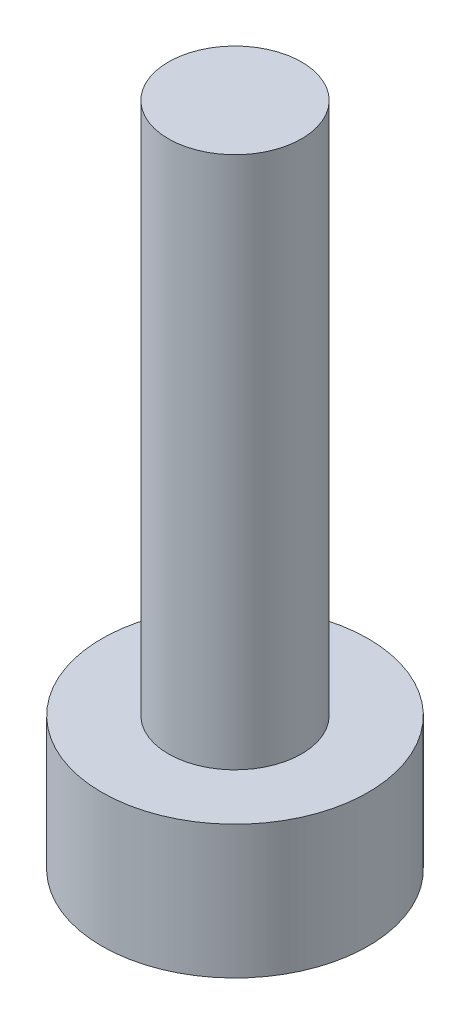
ISO-10303-21;
HEADER;
FILE_DESCRIPTION(('STEP AP214'),'2;1');
FILE_NAME('part.step','',(''),(''),'','','');
FILE_SCHEMA(('AUTOMOTIVE_DESIGN { 1 0 10303 214 1 1 1 1 }'));
ENDSEC;
DATA;
#1=APPLICATION_CONTEXT('core data for automotive mechanical design processes');
#2=APPLICATION_PROTOCOL_DEFINITION('international standard','automotive_design',2000,#1);
#3=PRODUCT_CONTEXT('',#1,'mechanical');
#4=PRODUCT('Part','Part','',(#3));
#5=PRODUCT_RELATED_PRODUCT_CATEGORY('part','',(#4));
#6=PRODUCT_DEFINITION_FORMATION('','',#4);
#7=PRODUCT_DEFINITION_CONTEXT('part definition',#1,'design');
#8=PRODUCT_DEFINITION('design','',#6,#7);
#9=PRODUCT_DEFINITION_SHAPE('','',#8);
#10=(LENGTH_UNIT() NAMED_UNIT(*) SI_UNIT(.MILLI.,.METRE.));
#11=(NAMED_UNIT(*) PLANE_ANGLE_UNIT() SI_UNIT($,.RADIAN.));
#12=(NAMED_UNIT(*) SI_UNIT($,.STERADIAN.) SOLID_ANGLE_UNIT());
#13=UNCERTAINTY_MEASURE_WITH_UNIT(LENGTH_MEASURE(1.E-05),#10,'distance_accuracy_value','');
#14=(GEOMETRIC_REPRESENTATION_CONTEXT(3) GLOBAL_UNCERTAINTY_ASSIGNED_CONTEXT((#13)) GLOBAL_UNIT_ASSIGNED_CONTEXT((#10,
#11,#12)) REPRESENTATION_CONTEXT('',''));
#15=CARTESIAN_POINT('',(0.,0.,0.));
#16=DIRECTION('',(0.,0.,1.));
#17=DIRECTION('',(1.,0.,0.));
#18=AXIS2_PLACEMENT_3D('',#15,#16,#17);
#19=CARTESIAN_POINT('',(0.,3.,0.));
#20=DIRECTION('',(0.,-1.,0.));
#21=DIRECTION('',(0.,0.,-1.));
#22=AXIS2_PLACEMENT_3D('',#19,#20,#21);
#23=CYLINDRICAL_SURFACE('',#22,3.);
#24=CARTESIAN_POINT('',(0.,3.,0.));
#25=DIRECTION('',(0.,1.,0.));
#26=DIRECTION('',(0.,0.,1.));
#27=AXIS2_PLACEMENT_3D('',#24,#25,#26);
#28=CIRCLE('',#27,3.);
#29=CARTESIAN_POINT('',(0.,3.,3.));
#30=VERTEX_POINT('',#29);
#31=EDGE_CURVE('E38',#30,#30,#28,.T.);
#32=ORIENTED_EDGE('',*,*,#31,.F.);
#33=EDGE_LOOP('',(#32));
#34=FACE_BOUND('',#33,.T.);
#35=CARTESIAN_POINT('',(0.,0.,0.));
#36=DIRECTION('',(0.,1.,0.));
#37=DIRECTION('',(0.,0.,1.));
#38=AXIS2_PLACEMENT_3D('',#35,#36,#37);
#39=CIRCLE('',#38,3.);
#40=CARTESIAN_POINT('',(0.,0.,3.));
#41=VERTEX_POINT('',#40);
#42=EDGE_CURVE('E34',#41,#41,#39,.T.);
#43=ORIENTED_EDGE('',*,*,#42,.T.);
#44=EDGE_LOOP('',(#43));
#45=FACE_BOUND('',#44,.T.);
#46=ADVANCED_FACE('F31',(#34,#45),#23,.T.);
#47=CARTESIAN_POINT('',(0.,3.,0.));
#48=DIRECTION('',(0.,1.,0.));
#49=DIRECTION('',(0.,0.,1.));
#50=AXIS2_PLACEMENT_3D('',#47,#48,#49);
#51=PLANE('',#50);
#52=CARTESIAN_POINT('',(0.,3.,0.));
#53=DIRECTION('',(0.,1.,0.));
#54=DIRECTION('',(0.,0.,1.));
#55=AXIS2_PLACEMENT_3D('',#52,#53,#54);
#56=CIRCLE('',#55,1.5);
#57=CARTESIAN_POINT('',(0.,3.,1.5));
#58=VERTEX_POINT('',#57);
#59=EDGE_CURVE('E10',#58,#58,#56,.T.);
#60=ORIENTED_EDGE('',*,*,#59,.F.);
#61=EDGE_LOOP('',(#60));
#62=FACE_BOUND('',#61,.T.);
#63=ORIENTED_EDGE('',*,*,#31,.T.);
#64=EDGE_LOOP('',(#63));
#65=FACE_BOUND('',#64,.T.);
#66=ADVANCED_FACE('F55',(#62,#65),#51,.T.);
#67=CARTESIAN_POINT('',(0.,0.,0.));
#68=DIRECTION('',(0.,1.,0.));
#69=DIRECTION('',(0.,0.,1.));
#70=AXIS2_PLACEMENT_3D('',#67,#68,#69);
#71=PLANE('',#70);
#72=ORIENTED_EDGE('',*,*,#42,.F.);
#73=EDGE_LOOP('',(#72));
#74=FACE_BOUND('',#73,.T.);
#75=ADVANCED_FACE('F52',(#74),#71,.F.);
#76=CARTESIAN_POINT('',(0.,15.,0.));
#77=DIRECTION('',(0.,-1.,0.));
#78=DIRECTION('',(0.,0.,-1.));
#79=AXIS2_PLACEMENT_3D('',#76,#77,#78);
#80=CYLINDRICAL_SURFACE('',#79,1.5);
#81=CARTESIAN_POINT('',(0.,15.,0.));
#82=DIRECTION('',(0.,1.,0.));
#83=DIRECTION('',(0.,0.,1.));
#84=AXIS2_PLACEMENT_3D('',#81,#82,#83);
#85=CIRCLE('',#84,1.5);
#86=CARTESIAN_POINT('',(0.,15.,1.5));
#87=VERTEX_POINT('',#86);
#88=EDGE_CURVE('E44',#87,#87,#85,.T.);
#89=ORIENTED_EDGE('',*,*,#88,.F.);
#90=EDGE_LOOP('',(#89));
#91=FACE_BOUND('',#90,.T.);
#92=ORIENTED_EDGE('',*,*,#59,.T.);
#93=EDGE_LOOP('',(#92));
#94=FACE_BOUND('',#93,.T.);
#95=ADVANCED_FACE('F54',(#91,#94),#80,.T.);
#96=CARTESIAN_POINT('',(0.,15.,0.));
#97=DIRECTION('',(0.,1.,0.));
#98=DIRECTION('',(0.,0.,1.));
#99=AXIS2_PLACEMENT_3D('',#96,#97,#98);
#100=PLANE('',#99);
#101=ORIENTED_EDGE('',*,*,#88,.T.);
#102=EDGE_LOOP('',(#101));
#103=FACE_BOUND('',#102,.T.);
#104=ADVANCED_FACE('F60',(#103),#100,.T.);
#105=CLOSED_SHELL('',(#46,#66,#75,#95,#104));
#106=MANIFOLD_SOLID_BREP('B2',#105);
#107=ADVANCED_BREP_SHAPE_REPRESENTATION('',(#18,#106),#14);
#108=SHAPE_DEFINITION_REPRESENTATION(#9,#107);
ENDSEC;
END-ISO-10303-21;
